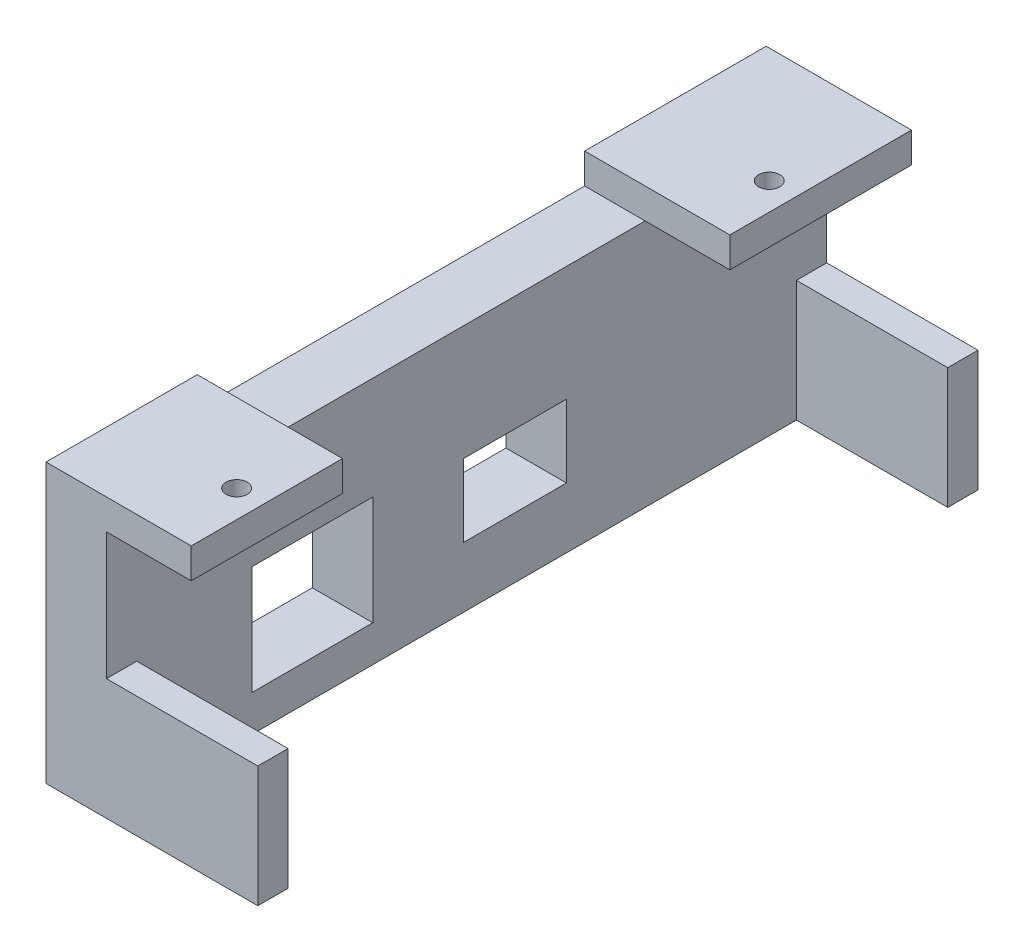
ISO-10303-21;
HEADER;
FILE_DESCRIPTION(('STEP AP214'),'2;1');
FILE_NAME('part.step','',(''),(''),'','','');
FILE_SCHEMA(('AUTOMOTIVE_DESIGN { 1 0 10303 214 1 1 1 1 }'));
ENDSEC;
DATA;
#1=APPLICATION_CONTEXT('core data for automotive mechanical design processes');
#2=APPLICATION_PROTOCOL_DEFINITION('international standard','automotive_design',2000,#1);
#3=PRODUCT_CONTEXT('',#1,'mechanical');
#4=PRODUCT('Part','Part','',(#3));
#5=PRODUCT_RELATED_PRODUCT_CATEGORY('part','',(#4));
#6=PRODUCT_DEFINITION_FORMATION('','',#4);
#7=PRODUCT_DEFINITION_CONTEXT('part definition',#1,'design');
#8=PRODUCT_DEFINITION('design','',#6,#7);
#9=PRODUCT_DEFINITION_SHAPE('','',#8);
#10=(LENGTH_UNIT() NAMED_UNIT(*) SI_UNIT(.MILLI.,.METRE.));
#11=(NAMED_UNIT(*) PLANE_ANGLE_UNIT() SI_UNIT($,.RADIAN.));
#12=(NAMED_UNIT(*) SI_UNIT($,.STERADIAN.) SOLID_ANGLE_UNIT());
#13=UNCERTAINTY_MEASURE_WITH_UNIT(LENGTH_MEASURE(1.E-05),#10,'distance_accuracy_value','');
#14=(GEOMETRIC_REPRESENTATION_CONTEXT(3) GLOBAL_UNCERTAINTY_ASSIGNED_CONTEXT((#13)) GLOBAL_UNIT_ASSIGNED_CONTEXT((#10,
#11,#12)) REPRESENTATION_CONTEXT('',''));
#15=CARTESIAN_POINT('',(0.,0.,0.));
#16=DIRECTION('',(0.,0.,1.));
#17=DIRECTION('',(1.,0.,0.));
#18=AXIS2_PLACEMENT_3D('',#15,#16,#17);
#19=CARTESIAN_POINT('',(5.,46.,59.5));
#20=DIRECTION('',(-1.,0.,0.));
#21=DIRECTION('',(0.,0.,1.));
#22=AXIS2_PLACEMENT_3D('',#19,#20,#21);
#23=PLANE('',#22);
#24=DIRECTION('',(0.,-1.,0.));
#25=VECTOR('',#24,1.);
#26=CARTESIAN_POINT('',(5.,46.,35.5));
#27=LINE('',#26,#25);
#28=CARTESIAN_POINT('',(5.,24.,35.5));
#29=VERTEX_POINT('',#28);
#30=CARTESIAN_POINT('',(5.,6.,35.5));
#31=VERTEX_POINT('',#30);
#32=EDGE_CURVE('E307',#29,#31,#27,.T.);
#33=ORIENTED_EDGE('',*,*,#32,.F.);
#34=DIRECTION('',(0.,0.,1.));
#35=VECTOR('',#34,1.);
#36=CARTESIAN_POINT('',(5.,24.,59.5));
#37=LINE('',#36,#35);
#38=CARTESIAN_POINT('',(5.,24.,15.5));
#39=VERTEX_POINT('',#38);
#40=EDGE_CURVE('E259',#39,#29,#37,.T.);
#41=ORIENTED_EDGE('',*,*,#40,.F.);
#42=DIRECTION('',(0.,-1.,0.));
#43=VECTOR('',#42,1.);
#44=CARTESIAN_POINT('',(5.,46.,15.5));
#45=LINE('',#44,#43);
#46=CARTESIAN_POINT('',(5.,6.,15.5));
#47=VERTEX_POINT('',#46);
#48=EDGE_CURVE('E301',#39,#47,#45,.T.);
#49=ORIENTED_EDGE('',*,*,#48,.T.);
#50=DIRECTION('',(0.,0.,1.));
#51=VECTOR('',#50,1.);
#52=CARTESIAN_POINT('',(5.,6.,59.5));
#53=LINE('',#52,#51);
#54=EDGE_CURVE('E304',#47,#31,#53,.T.);
#55=ORIENTED_EDGE('',*,*,#54,.T.);
#56=EDGE_LOOP('',(#33,#41,#49,#55));
#57=FACE_BOUND('',#56,.T.);
#58=DIRECTION('',(0.,-1.,0.));
#59=VECTOR('',#58,1.);
#60=CARTESIAN_POINT('',(5.,46.,0.499999999999994));
#61=LINE('',#60,#59);
#62=CARTESIAN_POINT('',(5.,22.,0.499999999999999));
#63=VERTEX_POINT('',#62);
#64=CARTESIAN_POINT('',(5.,10.,0.500000000000001));
#65=VERTEX_POINT('',#64);
#66=EDGE_CURVE('E317',#63,#65,#61,.T.);
#67=ORIENTED_EDGE('',*,*,#66,.F.);
#68=DIRECTION('',(0.,0.,1.));
#69=VECTOR('',#68,1.);
#70=CARTESIAN_POINT('',(5.,22.,59.5));
#71=LINE('',#70,#69);
#72=CARTESIAN_POINT('',(5.,22.,-16.5));
#73=VERTEX_POINT('',#72);
#74=EDGE_CURVE('E309',#73,#63,#71,.T.);
#75=ORIENTED_EDGE('',*,*,#74,.F.);
#76=DIRECTION('',(0.,-1.,0.));
#77=VECTOR('',#76,1.);
#78=CARTESIAN_POINT('',(5.,46.,-16.5));
#79=LINE('',#78,#77);
#80=CARTESIAN_POINT('',(5.,10.,-16.5));
#81=VERTEX_POINT('',#80);
#82=EDGE_CURVE('E311',#73,#81,#79,.T.);
#83=ORIENTED_EDGE('',*,*,#82,.T.);
#84=DIRECTION('',(0.,0.,1.));
#85=VECTOR('',#84,1.);
#86=CARTESIAN_POINT('',(5.,10.,59.5));
#87=LINE('',#86,#85);
#88=EDGE_CURVE('E314',#81,#65,#87,.T.);
#89=ORIENTED_EDGE('',*,*,#88,.T.);
#90=EDGE_LOOP('',(#67,#75,#83,#89));
#91=FACE_BOUND('',#90,.T.);
#92=DIRECTION('',(0.,0.,-1.));
#93=VECTOR('',#92,1.);
#94=CARTESIAN_POINT('',(5.,41.,-29.5));
#95=LINE('',#94,#93);
#96=CARTESIAN_POINT('',(5.,41.,-29.5));
#97=VERTEX_POINT('',#96);
#98=CARTESIAN_POINT('',(5.,41.,-59.5));
#99=VERTEX_POINT('',#98);
#100=EDGE_CURVE('E219',#97,#99,#95,.T.);
#101=ORIENTED_EDGE('',*,*,#100,.F.);
#102=DIRECTION('',(0.,0.,1.));
#103=VECTOR('',#102,1.);
#104=CARTESIAN_POINT('',(5.,41.,59.5));
#105=LINE('',#104,#103);
#106=CARTESIAN_POINT('',(5.,41.,34.5));
#107=VERTEX_POINT('',#106);
#108=EDGE_CURVE('E319',#97,#107,#105,.T.);
#109=ORIENTED_EDGE('',*,*,#108,.T.);
#110=DIRECTION('',(0.,0.,-1.));
#111=VECTOR('',#110,1.);
#112=CARTESIAN_POINT('',(5.,41.,59.5));
#113=LINE('',#112,#111);
#114=CARTESIAN_POINT('',(5.,41.,59.5));
#115=VERTEX_POINT('',#114);
#116=EDGE_CURVE('E225',#115,#107,#113,.T.);
#117=ORIENTED_EDGE('',*,*,#116,.F.);
#118=DIRECTION('',(0.,-1.,0.));
#119=VECTOR('',#118,1.);
#120=CARTESIAN_POINT('',(5.,46.,59.5));
#121=LINE('',#120,#119);
#122=CARTESIAN_POINT('',(5.,20.,59.5));
#123=VERTEX_POINT('',#122);
#124=EDGE_CURVE('E382',#115,#123,#121,.T.);
#125=ORIENTED_EDGE('',*,*,#124,.T.);
#126=DIRECTION('',(0.,0.,-1.));
#127=VECTOR('',#126,1.);
#128=CARTESIAN_POINT('',(5.,20.,59.5));
#129=LINE('',#128,#127);
#130=CARTESIAN_POINT('',(5.,20.,54.5));
#131=VERTEX_POINT('',#130);
#132=EDGE_CURVE('E369',#123,#131,#129,.T.);
#133=ORIENTED_EDGE('',*,*,#132,.T.);
#134=DIRECTION('',(0.,-1.,0.));
#135=VECTOR('',#134,1.);
#136=CARTESIAN_POINT('',(5.,46.,54.5));
#137=LINE('',#136,#135);
#138=CARTESIAN_POINT('',(5.,0.,54.5));
#139=VERTEX_POINT('',#138);
#140=EDGE_CURVE('E362',#131,#139,#137,.T.);
#141=ORIENTED_EDGE('',*,*,#140,.T.);
#142=DIRECTION('',(0.,0.,-1.));
#143=VECTOR('',#142,1.);
#144=CARTESIAN_POINT('',(5.,0.,59.5));
#145=LINE('',#144,#143);
#146=CARTESIAN_POINT('',(5.,0.,-54.5));
#147=VERTEX_POINT('',#146);
#148=EDGE_CURVE('E372',#139,#147,#145,.T.);
#149=ORIENTED_EDGE('',*,*,#148,.T.);
#150=DIRECTION('',(0.,1.,0.));
#151=VECTOR('',#150,1.);
#152=CARTESIAN_POINT('',(5.,46.,-54.5));
#153=LINE('',#152,#151);
#154=CARTESIAN_POINT('',(5.,20.,-54.5));
#155=VERTEX_POINT('',#154);
#156=EDGE_CURVE('E338',#147,#155,#153,.T.);
#157=ORIENTED_EDGE('',*,*,#156,.T.);
#158=DIRECTION('',(0.,0.,-1.));
#159=VECTOR('',#158,1.);
#160=CARTESIAN_POINT('',(5.,20.,59.5));
#161=LINE('',#160,#159);
#162=CARTESIAN_POINT('',(5.,20.,-59.5));
#163=VERTEX_POINT('',#162);
#164=EDGE_CURVE('E345',#155,#163,#161,.T.);
#165=ORIENTED_EDGE('',*,*,#164,.T.);
#166=DIRECTION('',(0.,-1.,0.));
#167=VECTOR('',#166,1.);
#168=CARTESIAN_POINT('',(5.,46.,-59.5));
#169=LINE('',#168,#167);
#170=EDGE_CURVE('E48',#99,#163,#169,.T.);
#171=ORIENTED_EDGE('',*,*,#170,.F.);
#172=EDGE_LOOP('',(#101,#109,#117,#125,#133,#141,#149,#157,#165,#171));
#173=FACE_BOUND('',#172,.T.);
#174=ADVANCED_FACE('F34',(#57,#91,#173),#23,.F.);
#175=CARTESIAN_POINT('',(-5.,46.,59.5));
#176=DIRECTION('',(1.,0.,0.));
#177=DIRECTION('',(0.,0.,-1.));
#178=AXIS2_PLACEMENT_3D('',#175,#176,#177);
#179=PLANE('',#178);
#180=DIRECTION('',(0.,0.,1.));
#181=VECTOR('',#180,1.);
#182=CARTESIAN_POINT('',(-5.,41.,0.));
#183=LINE('',#182,#181);
#184=CARTESIAN_POINT('',(-5.,41.,-29.5));
#185=VERTEX_POINT('',#184);
#186=CARTESIAN_POINT('',(-5.,41.,34.5));
#187=VERTEX_POINT('',#186);
#188=EDGE_CURVE('E250',#185,#187,#183,.T.);
#189=ORIENTED_EDGE('',*,*,#188,.F.);
#190=DIRECTION('',(0.,-1.,0.));
#191=VECTOR('',#190,1.);
#192=CARTESIAN_POINT('',(-5.,0.,-29.5));
#193=LINE('',#192,#191);
#194=CARTESIAN_POINT('',(-5.,46.,-29.5));
#195=VERTEX_POINT('',#194);
#196=EDGE_CURVE('E248',#195,#185,#193,.T.);
#197=ORIENTED_EDGE('',*,*,#196,.F.);
#198=DIRECTION('',(0.,0.,1.));
#199=VECTOR('',#198,1.);
#200=CARTESIAN_POINT('',(-5.,46.,59.5));
#201=LINE('',#200,#199);
#202=CARTESIAN_POINT('',(-5.,46.,-59.5));
#203=VERTEX_POINT('',#202);
#204=EDGE_CURVE('E377',#203,#195,#201,.T.);
#205=ORIENTED_EDGE('',*,*,#204,.F.);
#206=DIRECTION('',(0.,-1.,0.));
#207=VECTOR('',#206,1.);
#208=CARTESIAN_POINT('',(-5.,46.,-59.5));
#209=LINE('',#208,#207);
#210=CARTESIAN_POINT('',(-5.,0.,-59.5));
#211=VERTEX_POINT('',#210);
#212=EDGE_CURVE('E394',#203,#211,#209,.T.);
#213=ORIENTED_EDGE('',*,*,#212,.T.);
#214=DIRECTION('',(0.,0.,1.));
#215=VECTOR('',#214,1.);
#216=CARTESIAN_POINT('',(-5.,0.,59.5));
#217=LINE('',#216,#215);
#218=CARTESIAN_POINT('',(-5.,0.,59.5));
#219=VERTEX_POINT('',#218);
#220=EDGE_CURVE('E387',#211,#219,#217,.T.);
#221=ORIENTED_EDGE('',*,*,#220,.T.);
#222=DIRECTION('',(0.,-1.,0.));
#223=VECTOR('',#222,1.);
#224=CARTESIAN_POINT('',(-5.,46.,59.5));
#225=LINE('',#224,#223);
#226=CARTESIAN_POINT('',(-5.,46.,59.5));
#227=VERTEX_POINT('',#226);
#228=EDGE_CURVE('E391',#227,#219,#225,.T.);
#229=ORIENTED_EDGE('',*,*,#228,.F.);
#230=CARTESIAN_POINT('',(-5.,46.,34.5));
#231=VERTEX_POINT('',#230);
#232=EDGE_CURVE('E375',#231,#227,#201,.T.);
#233=ORIENTED_EDGE('',*,*,#232,.F.);
#234=DIRECTION('',(0.,-1.,0.));
#235=VECTOR('',#234,1.);
#236=CARTESIAN_POINT('',(-5.,0.,34.5));
#237=LINE('',#236,#235);
#238=EDGE_CURVE('E254',#231,#187,#237,.T.);
#239=ORIENTED_EDGE('',*,*,#238,.T.);
#240=EDGE_LOOP('',(#189,#197,#205,#213,#221,#229,#233,#239));
#241=FACE_BOUND('',#240,.T.);
#242=DIRECTION('',(0.,-1.,0.));
#243=VECTOR('',#242,1.);
#244=CARTESIAN_POINT('',(-5.,0.,35.5));
#245=LINE('',#244,#243);
#246=CARTESIAN_POINT('',(-5.,24.,35.5));
#247=VERTEX_POINT('',#246);
#248=CARTESIAN_POINT('',(-5.,6.,35.5));
#249=VERTEX_POINT('',#248);
#250=EDGE_CURVE('E247',#247,#249,#245,.T.);
#251=ORIENTED_EDGE('',*,*,#250,.T.);
#252=DIRECTION('',(0.,0.,1.));
#253=VECTOR('',#252,1.);
#254=CARTESIAN_POINT('',(-5.,6.,0.));
#255=LINE('',#254,#253);
#256=CARTESIAN_POINT('',(-5.,6.,15.5));
#257=VERTEX_POINT('',#256);
#258=EDGE_CURVE('E289',#257,#249,#255,.T.);
#259=ORIENTED_EDGE('',*,*,#258,.F.);
#260=DIRECTION('',(0.,-1.,0.));
#261=VECTOR('',#260,1.);
#262=CARTESIAN_POINT('',(-5.,0.,15.5));
#263=LINE('',#262,#261);
#264=CARTESIAN_POINT('',(-5.,24.,15.5));
#265=VERTEX_POINT('',#264);
#266=EDGE_CURVE('E286',#265,#257,#263,.T.);
#267=ORIENTED_EDGE('',*,*,#266,.F.);
#268=DIRECTION('',(0.,0.,1.));
#269=VECTOR('',#268,1.);
#270=CARTESIAN_POINT('',(-5.,24.,0.));
#271=LINE('',#270,#269);
#272=EDGE_CURVE('E283',#265,#247,#271,.T.);
#273=ORIENTED_EDGE('',*,*,#272,.T.);
#274=EDGE_LOOP('',(#251,#259,#267,#273));
#275=FACE_BOUND('',#274,.T.);
#276=DIRECTION('',(0.,-1.,0.));
#277=VECTOR('',#276,1.);
#278=CARTESIAN_POINT('',(-5.,0.,0.500000000000002));
#279=LINE('',#278,#277);
#280=CARTESIAN_POINT('',(-5.,22.,0.5));
#281=VERTEX_POINT('',#280);
#282=CARTESIAN_POINT('',(-5.,10.,0.500000000000001));
#283=VERTEX_POINT('',#282);
#284=EDGE_CURVE('E261',#281,#283,#279,.T.);
#285=ORIENTED_EDGE('',*,*,#284,.T.);
#286=DIRECTION('',(0.,0.,1.));
#287=VECTOR('',#286,1.);
#288=CARTESIAN_POINT('',(-5.,10.,0.));
#289=LINE('',#288,#287);
#290=CARTESIAN_POINT('',(-5.,10.,-16.5));
#291=VERTEX_POINT('',#290);
#292=EDGE_CURVE('E271',#291,#283,#289,.T.);
#293=ORIENTED_EDGE('',*,*,#292,.F.);
#294=DIRECTION('',(0.,-1.,0.));
#295=VECTOR('',#294,1.);
#296=CARTESIAN_POINT('',(-5.,0.,-16.5));
#297=LINE('',#296,#295);
#298=CARTESIAN_POINT('',(-5.,22.,-16.5));
#299=VERTEX_POINT('',#298);
#300=EDGE_CURVE('E268',#299,#291,#297,.T.);
#301=ORIENTED_EDGE('',*,*,#300,.F.);
#302=DIRECTION('',(0.,0.,1.));
#303=VECTOR('',#302,1.);
#304=CARTESIAN_POINT('',(-5.,22.,0.));
#305=LINE('',#304,#303);
#306=EDGE_CURVE('E264',#299,#281,#305,.T.);
#307=ORIENTED_EDGE('',*,*,#306,.T.);
#308=EDGE_LOOP('',(#285,#293,#301,#307));
#309=FACE_BOUND('',#308,.T.);
#310=ADVANCED_FACE('F425',(#241,#275,#309),#179,.F.);
#311=CARTESIAN_POINT('',(0.,46.,0.));
#312=DIRECTION('',(0.,-1.,0.));
#313=DIRECTION('',(0.,0.,-1.));
#314=AXIS2_PLACEMENT_3D('',#311,#312,#313);
#315=PLANE('',#314);
#316=CARTESIAN_POINT('',(14.5,46.,47.5));
#317=DIRECTION('',(0.,1.,0.));
#318=DIRECTION('',(0.,0.,1.));
#319=AXIS2_PLACEMENT_3D('',#316,#317,#318);
#320=CIRCLE('',#319,1.75);
#321=CARTESIAN_POINT('',(14.5,46.,49.25));
#322=VERTEX_POINT('',#321);
#323=EDGE_CURVE('E461',#322,#322,#320,.T.);
#324=ORIENTED_EDGE('',*,*,#323,.F.);
#325=EDGE_LOOP('',(#324));
#326=FACE_BOUND('',#325,.T.);
#327=DIRECTION('',(1.,0.,0.));
#328=VECTOR('',#327,1.);
#329=CARTESIAN_POINT('',(0.,46.,34.5));
#330=LINE('',#329,#328);
#331=CARTESIAN_POINT('',(19.,46.,34.5));
#332=VERTEX_POINT('',#331);
#333=EDGE_CURVE('E41',#231,#332,#330,.T.);
#334=ORIENTED_EDGE('',*,*,#333,.F.);
#335=ORIENTED_EDGE('',*,*,#232,.T.);
#336=DIRECTION('',(1.,0.,0.));
#337=VECTOR('',#336,1.);
#338=CARTESIAN_POINT('',(-5.,46.,59.5));
#339=LINE('',#338,#337);
#340=CARTESIAN_POINT('',(19.,46.,59.5));
#341=VERTEX_POINT('',#340);
#342=EDGE_CURVE('E380',#227,#341,#339,.T.);
#343=ORIENTED_EDGE('',*,*,#342,.T.);
#344=DIRECTION('',(0.,0.,1.));
#345=VECTOR('',#344,1.);
#346=CARTESIAN_POINT('',(19.,46.,59.5));
#347=LINE('',#346,#345);
#348=EDGE_CURVE('E240',#332,#341,#347,.T.);
#349=ORIENTED_EDGE('',*,*,#348,.F.);
#350=EDGE_LOOP('',(#334,#335,#343,#349));
#351=FACE_BOUND('',#350,.T.);
#352=ADVANCED_FACE('F407',(#326,#351),#315,.F.);
#353=CARTESIAN_POINT('',(-5.,46.,-59.5));
#354=DIRECTION('',(0.,0.,1.));
#355=DIRECTION('',(1.,0.,0.));
#356=AXIS2_PLACEMENT_3D('',#353,#354,#355);
#357=PLANE('',#356);
#358=DIRECTION('',(-1.,0.,0.));
#359=VECTOR('',#358,1.);
#360=CARTESIAN_POINT('',(-5.,46.,-59.5));
#361=LINE('',#360,#359);
#362=CARTESIAN_POINT('',(19.,46.,-59.5));
#363=VERTEX_POINT('',#362);
#364=EDGE_CURVE('E373',#363,#203,#361,.T.);
#365=ORIENTED_EDGE('',*,*,#364,.F.);
#366=DIRECTION('',(0.,1.,0.));
#367=VECTOR('',#366,1.);
#368=CARTESIAN_POINT('',(19.,41.,-59.5));
#369=LINE('',#368,#367);
#370=CARTESIAN_POINT('',(19.,41.,-59.5));
#371=VERTEX_POINT('',#370);
#372=EDGE_CURVE('E210',#371,#363,#369,.T.);
#373=ORIENTED_EDGE('',*,*,#372,.F.);
#374=DIRECTION('',(-1.,0.,0.));
#375=VECTOR('',#374,1.);
#376=CARTESIAN_POINT('',(19.,41.,-59.5));
#377=LINE('',#376,#375);
#378=EDGE_CURVE('E206',#371,#99,#377,.T.);
#379=ORIENTED_EDGE('',*,*,#378,.T.);
#380=ORIENTED_EDGE('',*,*,#170,.T.);
#381=DIRECTION('',(-1.,0.,0.));
#382=VECTOR('',#381,1.);
#383=CARTESIAN_POINT('',(30.,20.,-59.5));
#384=LINE('',#383,#382);
#385=CARTESIAN_POINT('',(30.,20.,-59.5));
#386=VERTEX_POINT('',#385);
#387=EDGE_CURVE('E335',#386,#163,#384,.T.);
#388=ORIENTED_EDGE('',*,*,#387,.F.);
#389=DIRECTION('',(0.,-1.,0.));
#390=VECTOR('',#389,1.);
#391=CARTESIAN_POINT('',(30.,0.,-59.5));
#392=LINE('',#391,#390);
#393=CARTESIAN_POINT('',(30.,0.,-59.5));
#394=VERTEX_POINT('',#393);
#395=EDGE_CURVE('E322',#386,#394,#392,.T.);
#396=ORIENTED_EDGE('',*,*,#395,.T.);
#397=DIRECTION('',(-1.,0.,0.));
#398=VECTOR('',#397,1.);
#399=CARTESIAN_POINT('',(-5.,0.,-59.5));
#400=LINE('',#399,#398);
#401=EDGE_CURVE('E384',#394,#211,#400,.T.);
#402=ORIENTED_EDGE('',*,*,#401,.T.);
#403=ORIENTED_EDGE('',*,*,#212,.F.);
#404=EDGE_LOOP('',(#365,#373,#379,#380,#388,#396,#402,#403));
#405=FACE_BOUND('',#404,.T.);
#406=ADVANCED_FACE('F456',(#405),#357,.F.);
#407=CARTESIAN_POINT('',(-5.,46.,59.5));
#408=DIRECTION('',(0.,0.,-1.));
#409=DIRECTION('',(-1.,0.,0.));
#410=AXIS2_PLACEMENT_3D('',#407,#408,#409);
#411=PLANE('',#410);
#412=ORIENTED_EDGE('',*,*,#228,.T.);
#413=DIRECTION('',(1.,0.,0.));
#414=VECTOR('',#413,1.);
#415=CARTESIAN_POINT('',(-5.,0.,59.5));
#416=LINE('',#415,#414);
#417=CARTESIAN_POINT('',(30.,0.,59.5));
#418=VERTEX_POINT('',#417);
#419=EDGE_CURVE('E376',#219,#418,#416,.T.);
#420=ORIENTED_EDGE('',*,*,#419,.T.);
#421=DIRECTION('',(0.,1.,0.));
#422=VECTOR('',#421,1.);
#423=CARTESIAN_POINT('',(30.,0.,59.5));
#424=LINE('',#423,#422);
#425=CARTESIAN_POINT('',(30.,20.,59.5));
#426=VERTEX_POINT('',#425);
#427=EDGE_CURVE('E347',#418,#426,#424,.T.);
#428=ORIENTED_EDGE('',*,*,#427,.T.);
#429=DIRECTION('',(-1.,0.,0.));
#430=VECTOR('',#429,1.);
#431=CARTESIAN_POINT('',(30.,20.,59.5));
#432=LINE('',#431,#430);
#433=EDGE_CURVE('E359',#426,#123,#432,.T.);
#434=ORIENTED_EDGE('',*,*,#433,.T.);
#435=ORIENTED_EDGE('',*,*,#124,.F.);
#436=DIRECTION('',(-1.,0.,0.));
#437=VECTOR('',#436,1.);
#438=CARTESIAN_POINT('',(19.,41.,59.5));
#439=LINE('',#438,#437);
#440=CARTESIAN_POINT('',(19.,41.,59.5));
#441=VERTEX_POINT('',#440);
#442=EDGE_CURVE('E245',#441,#115,#439,.T.);
#443=ORIENTED_EDGE('',*,*,#442,.F.);
#444=DIRECTION('',(0.,-1.,0.));
#445=VECTOR('',#444,1.);
#446=CARTESIAN_POINT('',(19.,46.,59.5));
#447=LINE('',#446,#445);
#448=EDGE_CURVE('E228',#341,#441,#447,.T.);
#449=ORIENTED_EDGE('',*,*,#448,.F.);
#450=ORIENTED_EDGE('',*,*,#342,.F.);
#451=EDGE_LOOP('',(#412,#420,#428,#434,#435,#443,#449,#450));
#452=FACE_BOUND('',#451,.T.);
#453=ADVANCED_FACE('F411',(#452),#411,.F.);
#454=CARTESIAN_POINT('',(14.5,46.,-40.5));
#455=DIRECTION('',(0.,1.,0.));
#456=DIRECTION('',(0.,0.,1.));
#457=AXIS2_PLACEMENT_3D('',#454,#455,#456);
#458=CIRCLE('',#457,1.75);
#459=CARTESIAN_POINT('',(14.5,46.,-38.75));
#460=VERTEX_POINT('',#459);
#461=EDGE_CURVE('E474',#460,#460,#458,.T.);
#462=ORIENTED_EDGE('',*,*,#461,.F.);
#463=EDGE_LOOP('',(#462));
#464=FACE_BOUND('',#463,.T.);
#465=ORIENTED_EDGE('',*,*,#204,.T.);
#466=DIRECTION('',(1.,0.,0.));
#467=VECTOR('',#466,1.);
#468=CARTESIAN_POINT('',(0.,46.,-29.5));
#469=LINE('',#468,#467);
#470=CARTESIAN_POINT('',(19.,46.,-29.5));
#471=VERTEX_POINT('',#470);
#472=EDGE_CURVE('E12',#195,#471,#469,.T.);
#473=ORIENTED_EDGE('',*,*,#472,.T.);
#474=DIRECTION('',(0.,0.,1.));
#475=VECTOR('',#474,1.);
#476=CARTESIAN_POINT('',(19.,46.,-29.5));
#477=LINE('',#476,#475);
#478=EDGE_CURVE('E217',#363,#471,#477,.T.);
#479=ORIENTED_EDGE('',*,*,#478,.F.);
#480=ORIENTED_EDGE('',*,*,#364,.T.);
#481=EDGE_LOOP('',(#465,#473,#479,#480));
#482=FACE_BOUND('',#481,.T.);
#483=ADVANCED_FACE('F496',(#464,#482),#315,.F.);
#484=CARTESIAN_POINT('',(0.,0.,0.));
#485=DIRECTION('',(0.,-1.,0.));
#486=DIRECTION('',(0.,0.,-1.));
#487=AXIS2_PLACEMENT_3D('',#484,#485,#486);
#488=PLANE('',#487);
#489=CARTESIAN_POINT('',(0.,0.,45.));
#490=DIRECTION('',(0.,-1.,0.));
#491=DIRECTION('',(0.,0.,-1.));
#492=AXIS2_PLACEMENT_3D('',#489,#490,#491);
#493=CIRCLE('',#492,2.);
#494=CARTESIAN_POINT('',(0.,0.,43.));
#495=VERTEX_POINT('',#494);
#496=EDGE_CURVE('E480',#495,#495,#493,.T.);
#497=ORIENTED_EDGE('',*,*,#496,.F.);
#498=EDGE_LOOP('',(#497));
#499=FACE_BOUND('',#498,.T.);
#500=CARTESIAN_POINT('',(0.,0.,-45.));
#501=DIRECTION('',(0.,-1.,0.));
#502=DIRECTION('',(0.,0.,-1.));
#503=AXIS2_PLACEMENT_3D('',#500,#501,#502);
#504=CIRCLE('',#503,2.);
#505=CARTESIAN_POINT('',(0.,0.,-47.));
#506=VERTEX_POINT('',#505);
#507=EDGE_CURVE('E469',#506,#506,#504,.T.);
#508=ORIENTED_EDGE('',*,*,#507,.F.);
#509=EDGE_LOOP('',(#508));
#510=FACE_BOUND('',#509,.T.);
#511=ORIENTED_EDGE('',*,*,#419,.F.);
#512=ORIENTED_EDGE('',*,*,#220,.F.);
#513=ORIENTED_EDGE('',*,*,#401,.F.);
#514=DIRECTION('',(0.,0.,1.));
#515=VECTOR('',#514,1.);
#516=CARTESIAN_POINT('',(30.,0.,-59.5));
#517=LINE('',#516,#515);
#518=CARTESIAN_POINT('',(30.,0.,-54.5));
#519=VERTEX_POINT('',#518);
#520=EDGE_CURVE('E325',#394,#519,#517,.T.);
#521=ORIENTED_EDGE('',*,*,#520,.T.);
#522=DIRECTION('',(-1.,0.,0.));
#523=VECTOR('',#522,1.);
#524=CARTESIAN_POINT('',(30.,0.,-54.5));
#525=LINE('',#524,#523);
#526=EDGE_CURVE('E334',#519,#147,#525,.T.);
#527=ORIENTED_EDGE('',*,*,#526,.T.);
#528=ORIENTED_EDGE('',*,*,#148,.F.);
#529=DIRECTION('',(-1.,0.,0.));
#530=VECTOR('',#529,1.);
#531=CARTESIAN_POINT('',(30.,0.,54.5));
#532=LINE('',#531,#530);
#533=CARTESIAN_POINT('',(30.,0.,54.5));
#534=VERTEX_POINT('',#533);
#535=EDGE_CURVE('E360',#534,#139,#532,.T.);
#536=ORIENTED_EDGE('',*,*,#535,.F.);
#537=DIRECTION('',(0.,0.,1.));
#538=VECTOR('',#537,1.);
#539=CARTESIAN_POINT('',(30.,0.,59.5));
#540=LINE('',#539,#538);
#541=EDGE_CURVE('E356',#534,#418,#540,.T.);
#542=ORIENTED_EDGE('',*,*,#541,.T.);
#543=EDGE_LOOP('',(#511,#512,#513,#521,#527,#528,#536,#542));
#544=FACE_BOUND('',#543,.T.);
#545=ADVANCED_FACE('F431',(#499,#510,#544),#488,.T.);
#546=CARTESIAN_POINT('',(30.,20.,59.5));
#547=DIRECTION('',(0.,1.,0.));
#548=DIRECTION('',(0.,0.,1.));
#549=AXIS2_PLACEMENT_3D('',#546,#547,#548);
#550=PLANE('',#549);
#551=ORIENTED_EDGE('',*,*,#132,.F.);
#552=ORIENTED_EDGE('',*,*,#433,.F.);
#553=DIRECTION('',(0.,0.,-1.));
#554=VECTOR('',#553,1.);
#555=CARTESIAN_POINT('',(30.,20.,59.5));
#556=LINE('',#555,#554);
#557=CARTESIAN_POINT('',(30.,20.,54.5));
#558=VERTEX_POINT('',#557);
#559=EDGE_CURVE('E350',#426,#558,#556,.T.);
#560=ORIENTED_EDGE('',*,*,#559,.T.);
#561=DIRECTION('',(-1.,0.,0.));
#562=VECTOR('',#561,1.);
#563=CARTESIAN_POINT('',(30.,20.,54.5));
#564=LINE('',#563,#562);
#565=EDGE_CURVE('E363',#558,#131,#564,.T.);
#566=ORIENTED_EDGE('',*,*,#565,.T.);
#567=EDGE_LOOP('',(#551,#552,#560,#566));
#568=FACE_BOUND('',#567,.T.);
#569=ADVANCED_FACE('F440',(#568),#550,.T.);
#570=CARTESIAN_POINT('',(30.,0.,54.5));
#571=DIRECTION('',(0.,0.,-1.));
#572=DIRECTION('',(-1.,0.,0.));
#573=AXIS2_PLACEMENT_3D('',#570,#571,#572);
#574=PLANE('',#573);
#575=ORIENTED_EDGE('',*,*,#140,.F.);
#576=ORIENTED_EDGE('',*,*,#565,.F.);
#577=DIRECTION('',(0.,-1.,0.));
#578=VECTOR('',#577,1.);
#579=CARTESIAN_POINT('',(30.,0.,54.5));
#580=LINE('',#579,#578);
#581=EDGE_CURVE('E353',#558,#534,#580,.T.);
#582=ORIENTED_EDGE('',*,*,#581,.T.);
#583=ORIENTED_EDGE('',*,*,#535,.T.);
#584=EDGE_LOOP('',(#575,#576,#582,#583));
#585=FACE_BOUND('',#584,.T.);
#586=ADVANCED_FACE('F503',(#585),#574,.T.);
#587=CARTESIAN_POINT('',(30.,0.,0.));
#588=DIRECTION('',(-1.,0.,0.));
#589=DIRECTION('',(0.,0.,1.));
#590=AXIS2_PLACEMENT_3D('',#587,#588,#589);
#591=PLANE('',#590);
#592=ORIENTED_EDGE('',*,*,#427,.F.);
#593=ORIENTED_EDGE('',*,*,#541,.F.);
#594=ORIENTED_EDGE('',*,*,#581,.F.);
#595=ORIENTED_EDGE('',*,*,#559,.F.);
#596=EDGE_LOOP('',(#592,#593,#594,#595));
#597=FACE_BOUND('',#596,.T.);
#598=ADVANCED_FACE('F437',(#597),#591,.F.);
#599=CARTESIAN_POINT('',(30.,20.,-59.5));
#600=DIRECTION('',(0.,1.,0.));
#601=DIRECTION('',(0.,0.,1.));
#602=AXIS2_PLACEMENT_3D('',#599,#600,#601);
#603=PLANE('',#602);
#604=ORIENTED_EDGE('',*,*,#164,.F.);
#605=DIRECTION('',(-1.,0.,0.));
#606=VECTOR('',#605,1.);
#607=CARTESIAN_POINT('',(30.,20.,-54.5));
#608=LINE('',#607,#606);
#609=CARTESIAN_POINT('',(30.,20.,-54.5));
#610=VERTEX_POINT('',#609);
#611=EDGE_CURVE('E339',#610,#155,#608,.T.);
#612=ORIENTED_EDGE('',*,*,#611,.F.);
#613=DIRECTION('',(0.,0.,-1.));
#614=VECTOR('',#613,1.);
#615=CARTESIAN_POINT('',(30.,20.,-59.5));
#616=LINE('',#615,#614);
#617=EDGE_CURVE('E331',#610,#386,#616,.T.);
#618=ORIENTED_EDGE('',*,*,#617,.T.);
#619=ORIENTED_EDGE('',*,*,#387,.T.);
#620=EDGE_LOOP('',(#604,#612,#618,#619));
#621=FACE_BOUND('',#620,.T.);
#622=ADVANCED_FACE('F454',(#621),#603,.T.);
#623=CARTESIAN_POINT('',(30.,0.,-54.5));
#624=DIRECTION('',(0.,0.,1.));
#625=DIRECTION('',(1.,0.,0.));
#626=AXIS2_PLACEMENT_3D('',#623,#624,#625);
#627=PLANE('',#626);
#628=ORIENTED_EDGE('',*,*,#156,.F.);
#629=ORIENTED_EDGE('',*,*,#526,.F.);
#630=DIRECTION('',(0.,1.,0.));
#631=VECTOR('',#630,1.);
#632=CARTESIAN_POINT('',(30.,0.,-54.5));
#633=LINE('',#632,#631);
#634=EDGE_CURVE('E328',#519,#610,#633,.T.);
#635=ORIENTED_EDGE('',*,*,#634,.T.);
#636=ORIENTED_EDGE('',*,*,#611,.T.);
#637=EDGE_LOOP('',(#628,#629,#635,#636));
#638=FACE_BOUND('',#637,.T.);
#639=ADVANCED_FACE('F447',(#638),#627,.T.);
#640=CARTESIAN_POINT('',(30.,0.,0.));
#641=DIRECTION('',(1.,0.,0.));
#642=DIRECTION('',(0.,0.,-1.));
#643=AXIS2_PLACEMENT_3D('',#640,#641,#642);
#644=PLANE('',#643);
#645=ORIENTED_EDGE('',*,*,#395,.F.);
#646=ORIENTED_EDGE('',*,*,#617,.F.);
#647=ORIENTED_EDGE('',*,*,#634,.F.);
#648=ORIENTED_EDGE('',*,*,#520,.F.);
#649=EDGE_LOOP('',(#645,#646,#647,#648));
#650=FACE_BOUND('',#649,.T.);
#651=ADVANCED_FACE('F451',(#650),#644,.T.);
#652=CARTESIAN_POINT('',(25.,41.,0.));
#653=DIRECTION('',(0.,-1.,0.));
#654=DIRECTION('',(0.,0.,-1.));
#655=AXIS2_PLACEMENT_3D('',#652,#653,#654);
#656=PLANE('',#655);
#657=DIRECTION('',(-1.,0.,0.));
#658=VECTOR('',#657,1.);
#659=CARTESIAN_POINT('',(25.,41.,-29.5));
#660=LINE('',#659,#658);
#661=EDGE_CURVE('E223',#97,#185,#660,.T.);
#662=ORIENTED_EDGE('',*,*,#661,.T.);
#663=ORIENTED_EDGE('',*,*,#188,.T.);
#664=DIRECTION('',(-1.,0.,0.));
#665=VECTOR('',#664,1.);
#666=CARTESIAN_POINT('',(25.,41.,34.5));
#667=LINE('',#666,#665);
#668=EDGE_CURVE('E257',#107,#187,#667,.T.);
#669=ORIENTED_EDGE('',*,*,#668,.F.);
#670=ORIENTED_EDGE('',*,*,#108,.F.);
#671=EDGE_LOOP('',(#662,#663,#669,#670));
#672=FACE_BOUND('',#671,.T.);
#673=ADVANCED_FACE('F421',(#672),#656,.F.);
#674=CARTESIAN_POINT('',(25.,0.,-29.5));
#675=DIRECTION('',(0.,0.,-1.));
#676=DIRECTION('',(-1.,0.,0.));
#677=AXIS2_PLACEMENT_3D('',#674,#675,#676);
#678=PLANE('',#677);
#679=ORIENTED_EDGE('',*,*,#472,.F.);
#680=ORIENTED_EDGE('',*,*,#196,.T.);
#681=ORIENTED_EDGE('',*,*,#661,.F.);
#682=DIRECTION('',(-1.,0.,0.));
#683=VECTOR('',#682,1.);
#684=CARTESIAN_POINT('',(19.,41.,-29.5));
#685=LINE('',#684,#683);
#686=CARTESIAN_POINT('',(19.,41.,-29.5));
#687=VERTEX_POINT('',#686);
#688=EDGE_CURVE('E204',#687,#97,#685,.T.);
#689=ORIENTED_EDGE('',*,*,#688,.F.);
#690=DIRECTION('',(0.,-1.,0.));
#691=VECTOR('',#690,1.);
#692=CARTESIAN_POINT('',(19.,41.,-29.5));
#693=LINE('',#692,#691);
#694=EDGE_CURVE('E211',#471,#687,#693,.T.);
#695=ORIENTED_EDGE('',*,*,#694,.F.);
#696=EDGE_LOOP('',(#679,#680,#681,#689,#695));
#697=FACE_BOUND('',#696,.T.);
#698=ADVANCED_FACE('F221',(#697),#678,.F.);
#699=CARTESIAN_POINT('',(25.,0.,34.5));
#700=DIRECTION('',(0.,0.,-1.));
#701=DIRECTION('',(-1.,0.,0.));
#702=AXIS2_PLACEMENT_3D('',#699,#700,#701);
#703=PLANE('',#702);
#704=ORIENTED_EDGE('',*,*,#333,.T.);
#705=DIRECTION('',(0.,1.,0.));
#706=VECTOR('',#705,1.);
#707=CARTESIAN_POINT('',(19.,46.,34.5));
#708=LINE('',#707,#706);
#709=CARTESIAN_POINT('',(19.,41.,34.5));
#710=VERTEX_POINT('',#709);
#711=EDGE_CURVE('E237',#710,#332,#708,.T.);
#712=ORIENTED_EDGE('',*,*,#711,.F.);
#713=DIRECTION('',(-1.,0.,0.));
#714=VECTOR('',#713,1.);
#715=CARTESIAN_POINT('',(19.,41.,34.5));
#716=LINE('',#715,#714);
#717=EDGE_CURVE('E242',#710,#107,#716,.T.);
#718=ORIENTED_EDGE('',*,*,#717,.T.);
#719=ORIENTED_EDGE('',*,*,#668,.T.);
#720=ORIENTED_EDGE('',*,*,#238,.F.);
#721=EDGE_LOOP('',(#704,#712,#718,#719,#720));
#722=FACE_BOUND('',#721,.T.);
#723=ADVANCED_FACE('F399',(#722),#703,.T.);
#724=CARTESIAN_POINT('',(25.,0.,35.5));
#725=DIRECTION('',(0.,0.,-1.));
#726=DIRECTION('',(0.,1.,0.));
#727=AXIS2_PLACEMENT_3D('',#724,#725,#726);
#728=PLANE('',#727);
#729=ORIENTED_EDGE('',*,*,#32,.T.);
#730=DIRECTION('',(-1.,0.,0.));
#731=VECTOR('',#730,1.);
#732=CARTESIAN_POINT('',(25.,6.,35.5));
#733=LINE('',#732,#731);
#734=EDGE_CURVE('E265',#31,#249,#733,.T.);
#735=ORIENTED_EDGE('',*,*,#734,.T.);
#736=ORIENTED_EDGE('',*,*,#250,.F.);
#737=DIRECTION('',(-1.,0.,0.));
#738=VECTOR('',#737,1.);
#739=CARTESIAN_POINT('',(25.,24.,35.5));
#740=LINE('',#739,#738);
#741=EDGE_CURVE('E292',#29,#247,#740,.T.);
#742=ORIENTED_EDGE('',*,*,#741,.F.);
#743=EDGE_LOOP('',(#729,#735,#736,#742));
#744=FACE_BOUND('',#743,.T.);
#745=ADVANCED_FACE('F550',(#744),#728,.T.);
#746=CARTESIAN_POINT('',(25.,6.,0.));
#747=DIRECTION('',(0.,-1.,0.));
#748=DIRECTION('',(0.,0.,-1.));
#749=AXIS2_PLACEMENT_3D('',#746,#747,#748);
#750=PLANE('',#749);
#751=DIRECTION('',(-1.,0.,0.));
#752=VECTOR('',#751,1.);
#753=CARTESIAN_POINT('',(25.,6.,15.5));
#754=LINE('',#753,#752);
#755=EDGE_CURVE('E294',#47,#257,#754,.T.);
#756=ORIENTED_EDGE('',*,*,#755,.T.);
#757=ORIENTED_EDGE('',*,*,#258,.T.);
#758=ORIENTED_EDGE('',*,*,#734,.F.);
#759=ORIENTED_EDGE('',*,*,#54,.F.);
#760=EDGE_LOOP('',(#756,#757,#758,#759));
#761=FACE_BOUND('',#760,.T.);
#762=ADVANCED_FACE('F546',(#761),#750,.F.);
#763=CARTESIAN_POINT('',(25.,0.,15.5));
#764=DIRECTION('',(0.,0.,-1.));
#765=DIRECTION('',(0.,1.,0.));
#766=AXIS2_PLACEMENT_3D('',#763,#764,#765);
#767=PLANE('',#766);
#768=DIRECTION('',(-1.,0.,0.));
#769=VECTOR('',#768,1.);
#770=CARTESIAN_POINT('',(25.,24.,15.5));
#771=LINE('',#770,#769);
#772=EDGE_CURVE('E296',#39,#265,#771,.T.);
#773=ORIENTED_EDGE('',*,*,#772,.T.);
#774=ORIENTED_EDGE('',*,*,#266,.T.);
#775=ORIENTED_EDGE('',*,*,#755,.F.);
#776=ORIENTED_EDGE('',*,*,#48,.F.);
#777=EDGE_LOOP('',(#773,#774,#775,#776));
#778=FACE_BOUND('',#777,.T.);
#779=ADVANCED_FACE('F549',(#778),#767,.F.);
#780=CARTESIAN_POINT('',(25.,24.,0.));
#781=DIRECTION('',(0.,-1.,0.));
#782=DIRECTION('',(0.,0.,-1.));
#783=AXIS2_PLACEMENT_3D('',#780,#781,#782);
#784=PLANE('',#783);
#785=ORIENTED_EDGE('',*,*,#40,.T.);
#786=ORIENTED_EDGE('',*,*,#741,.T.);
#787=ORIENTED_EDGE('',*,*,#272,.F.);
#788=ORIENTED_EDGE('',*,*,#772,.F.);
#789=EDGE_LOOP('',(#785,#786,#787,#788));
#790=FACE_BOUND('',#789,.T.);
#791=ADVANCED_FACE('F545',(#790),#784,.T.);
#792=CARTESIAN_POINT('',(25.,0.,0.500000000000002));
#793=DIRECTION('',(0.,0.,-1.));
#794=DIRECTION('',(0.,1.,0.));
#795=AXIS2_PLACEMENT_3D('',#792,#793,#794);
#796=PLANE('',#795);
#797=ORIENTED_EDGE('',*,*,#66,.T.);
#798=DIRECTION('',(-1.,0.,0.));
#799=VECTOR('',#798,1.);
#800=CARTESIAN_POINT('',(25.,10.,0.500000000000001));
#801=LINE('',#800,#799);
#802=EDGE_CURVE('E251',#65,#283,#801,.T.);
#803=ORIENTED_EDGE('',*,*,#802,.T.);
#804=ORIENTED_EDGE('',*,*,#284,.F.);
#805=DIRECTION('',(-1.,0.,0.));
#806=VECTOR('',#805,1.);
#807=CARTESIAN_POINT('',(25.,22.,0.499999999999999));
#808=LINE('',#807,#806);
#809=EDGE_CURVE('E274',#63,#281,#808,.T.);
#810=ORIENTED_EDGE('',*,*,#809,.F.);
#811=EDGE_LOOP('',(#797,#803,#804,#810));
#812=FACE_BOUND('',#811,.T.);
#813=ADVANCED_FACE('F523',(#812),#796,.T.);
#814=CARTESIAN_POINT('',(25.,10.,0.));
#815=DIRECTION('',(0.,-1.,0.));
#816=DIRECTION('',(0.,0.,-1.));
#817=AXIS2_PLACEMENT_3D('',#814,#815,#816);
#818=PLANE('',#817);
#819=DIRECTION('',(-1.,0.,0.));
#820=VECTOR('',#819,1.);
#821=CARTESIAN_POINT('',(25.,10.,-16.5));
#822=LINE('',#821,#820);
#823=EDGE_CURVE('E276',#81,#291,#822,.T.);
#824=ORIENTED_EDGE('',*,*,#823,.T.);
#825=ORIENTED_EDGE('',*,*,#292,.T.);
#826=ORIENTED_EDGE('',*,*,#802,.F.);
#827=ORIENTED_EDGE('',*,*,#88,.F.);
#828=EDGE_LOOP('',(#824,#825,#826,#827));
#829=FACE_BOUND('',#828,.T.);
#830=ADVANCED_FACE('F525',(#829),#818,.F.);
#831=CARTESIAN_POINT('',(25.,0.,-16.5));
#832=DIRECTION('',(0.,0.,-1.));
#833=DIRECTION('',(-1.,0.,0.));
#834=AXIS2_PLACEMENT_3D('',#831,#832,#833);
#835=PLANE('',#834);
#836=DIRECTION('',(-1.,0.,0.));
#837=VECTOR('',#836,1.);
#838=CARTESIAN_POINT('',(25.,22.,-16.5));
#839=LINE('',#838,#837);
#840=EDGE_CURVE('E56',#73,#299,#839,.T.);
#841=ORIENTED_EDGE('',*,*,#840,.T.);
#842=ORIENTED_EDGE('',*,*,#300,.T.);
#843=ORIENTED_EDGE('',*,*,#823,.F.);
#844=ORIENTED_EDGE('',*,*,#82,.F.);
#845=EDGE_LOOP('',(#841,#842,#843,#844));
#846=FACE_BOUND('',#845,.T.);
#847=ADVANCED_FACE('F532',(#846),#835,.F.);
#848=CARTESIAN_POINT('',(25.,22.,0.));
#849=DIRECTION('',(0.,-1.,0.));
#850=DIRECTION('',(0.,0.,-1.));
#851=AXIS2_PLACEMENT_3D('',#848,#849,#850);
#852=PLANE('',#851);
#853=ORIENTED_EDGE('',*,*,#74,.T.);
#854=ORIENTED_EDGE('',*,*,#809,.T.);
#855=ORIENTED_EDGE('',*,*,#306,.F.);
#856=ORIENTED_EDGE('',*,*,#840,.F.);
#857=EDGE_LOOP('',(#853,#854,#855,#856));
#858=FACE_BOUND('',#857,.T.);
#859=ADVANCED_FACE('F530',(#858),#852,.T.);
#860=CARTESIAN_POINT('',(19.,41.,59.5));
#861=DIRECTION('',(0.,1.,0.));
#862=DIRECTION('',(0.,0.,1.));
#863=AXIS2_PLACEMENT_3D('',#860,#861,#862);
#864=PLANE('',#863);
#865=CARTESIAN_POINT('',(14.5,41.,47.5));
#866=DIRECTION('',(0.,1.,0.));
#867=DIRECTION('',(0.,0.,1.));
#868=AXIS2_PLACEMENT_3D('',#865,#866,#867);
#869=CIRCLE('',#868,1.75);
#870=CARTESIAN_POINT('',(14.5,41.,49.25));
#871=VERTEX_POINT('',#870);
#872=EDGE_CURVE('E459',#871,#871,#869,.T.);
#873=ORIENTED_EDGE('',*,*,#872,.T.);
#874=EDGE_LOOP('',(#873));
#875=FACE_BOUND('',#874,.T.);
#876=ORIENTED_EDGE('',*,*,#116,.T.);
#877=ORIENTED_EDGE('',*,*,#717,.F.);
#878=DIRECTION('',(0.,0.,-1.));
#879=VECTOR('',#878,1.);
#880=CARTESIAN_POINT('',(19.,41.,59.5));
#881=LINE('',#880,#879);
#882=EDGE_CURVE('E235',#441,#710,#881,.T.);
#883=ORIENTED_EDGE('',*,*,#882,.F.);
#884=ORIENTED_EDGE('',*,*,#442,.T.);
#885=EDGE_LOOP('',(#876,#877,#883,#884));
#886=FACE_BOUND('',#885,.T.);
#887=ADVANCED_FACE('F417',(#875,#886),#864,.F.);
#888=CARTESIAN_POINT('',(19.,0.,0.));
#889=DIRECTION('',(1.,0.,0.));
#890=DIRECTION('',(0.,0.,-1.));
#891=AXIS2_PLACEMENT_3D('',#888,#889,#890);
#892=PLANE('',#891);
#893=ORIENTED_EDGE('',*,*,#448,.T.);
#894=ORIENTED_EDGE('',*,*,#882,.T.);
#895=ORIENTED_EDGE('',*,*,#711,.T.);
#896=ORIENTED_EDGE('',*,*,#348,.T.);
#897=EDGE_LOOP('',(#893,#894,#895,#896));
#898=FACE_BOUND('',#897,.T.);
#899=ADVANCED_FACE('F404',(#898),#892,.T.);
#900=CARTESIAN_POINT('',(19.,41.,-29.5));
#901=DIRECTION('',(0.,1.,0.));
#902=DIRECTION('',(0.,0.,1.));
#903=AXIS2_PLACEMENT_3D('',#900,#901,#902);
#904=PLANE('',#903);
#905=CARTESIAN_POINT('',(14.5,41.,-40.5));
#906=DIRECTION('',(0.,1.,0.));
#907=DIRECTION('',(0.,0.,1.));
#908=AXIS2_PLACEMENT_3D('',#905,#906,#907);
#909=CIRCLE('',#908,1.75);
#910=CARTESIAN_POINT('',(14.5,41.,-38.75));
#911=VERTEX_POINT('',#910);
#912=EDGE_CURVE('E466',#911,#911,#909,.T.);
#913=ORIENTED_EDGE('',*,*,#912,.T.);
#914=EDGE_LOOP('',(#913));
#915=FACE_BOUND('',#914,.T.);
#916=ORIENTED_EDGE('',*,*,#100,.T.);
#917=ORIENTED_EDGE('',*,*,#378,.F.);
#918=DIRECTION('',(0.,0.,-1.));
#919=VECTOR('',#918,1.);
#920=CARTESIAN_POINT('',(19.,41.,-29.5));
#921=LINE('',#920,#919);
#922=EDGE_CURVE('E200',#687,#371,#921,.T.);
#923=ORIENTED_EDGE('',*,*,#922,.F.);
#924=ORIENTED_EDGE('',*,*,#688,.T.);
#925=EDGE_LOOP('',(#916,#917,#923,#924));
#926=FACE_BOUND('',#925,.T.);
#927=ADVANCED_FACE('F202',(#915,#926),#904,.F.);
#928=CARTESIAN_POINT('',(19.,0.,0.));
#929=DIRECTION('',(-1.,0.,0.));
#930=DIRECTION('',(0.,0.,1.));
#931=AXIS2_PLACEMENT_3D('',#928,#929,#930);
#932=PLANE('',#931);
#933=ORIENTED_EDGE('',*,*,#694,.T.);
#934=ORIENTED_EDGE('',*,*,#922,.T.);
#935=ORIENTED_EDGE('',*,*,#372,.T.);
#936=ORIENTED_EDGE('',*,*,#478,.T.);
#937=EDGE_LOOP('',(#933,#934,#935,#936));
#938=FACE_BOUND('',#937,.T.);
#939=ADVANCED_FACE('F215',(#938),#932,.F.);
#940=CARTESIAN_POINT('',(14.5,41.,-40.5));
#941=DIRECTION('',(0.,1.,0.));
#942=DIRECTION('',(0.,0.,1.));
#943=AXIS2_PLACEMENT_3D('',#940,#941,#942);
#944=CYLINDRICAL_SURFACE('',#943,1.75);
#945=ORIENTED_EDGE('',*,*,#912,.F.);
#946=EDGE_LOOP('',(#945));
#947=FACE_BOUND('',#946,.T.);
#948=ORIENTED_EDGE('',*,*,#461,.T.);
#949=EDGE_LOOP('',(#948));
#950=FACE_BOUND('',#949,.T.);
#951=ADVANCED_FACE('F701',(#947,#950),#944,.F.);
#952=CARTESIAN_POINT('',(14.5,41.,47.5));
#953=DIRECTION('',(0.,1.,0.));
#954=DIRECTION('',(0.,0.,1.));
#955=AXIS2_PLACEMENT_3D('',#952,#953,#954);
#956=CYLINDRICAL_SURFACE('',#955,1.75);
#957=ORIENTED_EDGE('',*,*,#872,.F.);
#958=EDGE_LOOP('',(#957));
#959=FACE_BOUND('',#958,.T.);
#960=ORIENTED_EDGE('',*,*,#323,.T.);
#961=EDGE_LOOP('',(#960));
#962=FACE_BOUND('',#961,.T.);
#963=ADVANCED_FACE('F706',(#959,#962),#956,.F.);
#964=CARTESIAN_POINT('',(0.,10.,-45.));
#965=DIRECTION('',(0.,-1.,0.));
#966=DIRECTION('',(0.,0.,-1.));
#967=AXIS2_PLACEMENT_3D('',#964,#965,#966);
#968=CYLINDRICAL_SURFACE('',#967,2.);
#969=CARTESIAN_POINT('',(0.,10.,-45.));
#970=DIRECTION('',(0.,-1.,0.));
#971=DIRECTION('',(0.,0.,-1.));
#972=AXIS2_PLACEMENT_3D('',#969,#970,#971);
#973=CIRCLE('',#972,2.);
#974=CARTESIAN_POINT('',(0.,10.,-47.));
#975=VERTEX_POINT('',#974);
#976=EDGE_CURVE('E485',#975,#975,#973,.T.);
#977=ORIENTED_EDGE('',*,*,#976,.F.);
#978=EDGE_LOOP('',(#977));
#979=FACE_BOUND('',#978,.T.);
#980=ORIENTED_EDGE('',*,*,#507,.T.);
#981=EDGE_LOOP('',(#980));
#982=FACE_BOUND('',#981,.T.);
#983=ADVANCED_FACE('F493',(#979,#982),#968,.F.);
#984=CARTESIAN_POINT('',(0.,10.,-45.));
#985=DIRECTION('',(0.,-1.,0.));
#986=DIRECTION('',(0.,0.,-1.));
#987=AXIS2_PLACEMENT_3D('',#984,#985,#986);
#988=PLANE('',#987);
#989=ORIENTED_EDGE('',*,*,#976,.T.);
#990=EDGE_LOOP('',(#989));
#991=FACE_BOUND('',#990,.T.);
#992=ADVANCED_FACE('F731',(#991),#988,.T.);
#993=CARTESIAN_POINT('',(0.,10.,45.));
#994=DIRECTION('',(0.,-1.,0.));
#995=DIRECTION('',(0.,0.,-1.));
#996=AXIS2_PLACEMENT_3D('',#993,#994,#995);
#997=CYLINDRICAL_SURFACE('',#996,2.);
#998=CARTESIAN_POINT('',(0.,10.,45.));
#999=DIRECTION('',(0.,-1.,0.));
#1000=DIRECTION('',(0.,0.,-1.));
#1001=AXIS2_PLACEMENT_3D('',#998,#999,#1000);
#1002=CIRCLE('',#1001,2.);
#1003=CARTESIAN_POINT('',(0.,10.,43.));
#1004=VERTEX_POINT('',#1003);
#1005=EDGE_CURVE('E476',#1004,#1004,#1002,.T.);
#1006=ORIENTED_EDGE('',*,*,#1005,.F.);
#1007=EDGE_LOOP('',(#1006));
#1008=FACE_BOUND('',#1007,.T.);
#1009=ORIENTED_EDGE('',*,*,#496,.T.);
#1010=EDGE_LOOP('',(#1009));
#1011=FACE_BOUND('',#1010,.T.);
#1012=ADVANCED_FACE('F741',(#1008,#1011),#997,.F.);
#1013=CARTESIAN_POINT('',(0.,10.,45.));
#1014=DIRECTION('',(0.,-1.,0.));
#1015=DIRECTION('',(0.,0.,-1.));
#1016=AXIS2_PLACEMENT_3D('',#1013,#1014,#1015);
#1017=PLANE('',#1016);
#1018=ORIENTED_EDGE('',*,*,#1005,.T.);
#1019=EDGE_LOOP('',(#1018));
#1020=FACE_BOUND('',#1019,.T.);
#1021=ADVANCED_FACE('F750',(#1020),#1017,.T.);
#1022=CLOSED_SHELL('',(#174,#310,#352,#406,#453,#483,#545,#569,#586,#598,#622,#639,#651,#673,
#698,#723,#745,#762,#779,#791,#813,#830,#847,#859,#887,#899,#927,#939,#951,#963,#983,#992,#1012,#1021));
#1023=MANIFOLD_SOLID_BREP('B2',#1022);
#1024=ADVANCED_BREP_SHAPE_REPRESENTATION('',(#18,#1023),#14);
#1025=SHAPE_DEFINITION_REPRESENTATION(#9,#1024);
ENDSEC;
END-ISO-10303-21;
